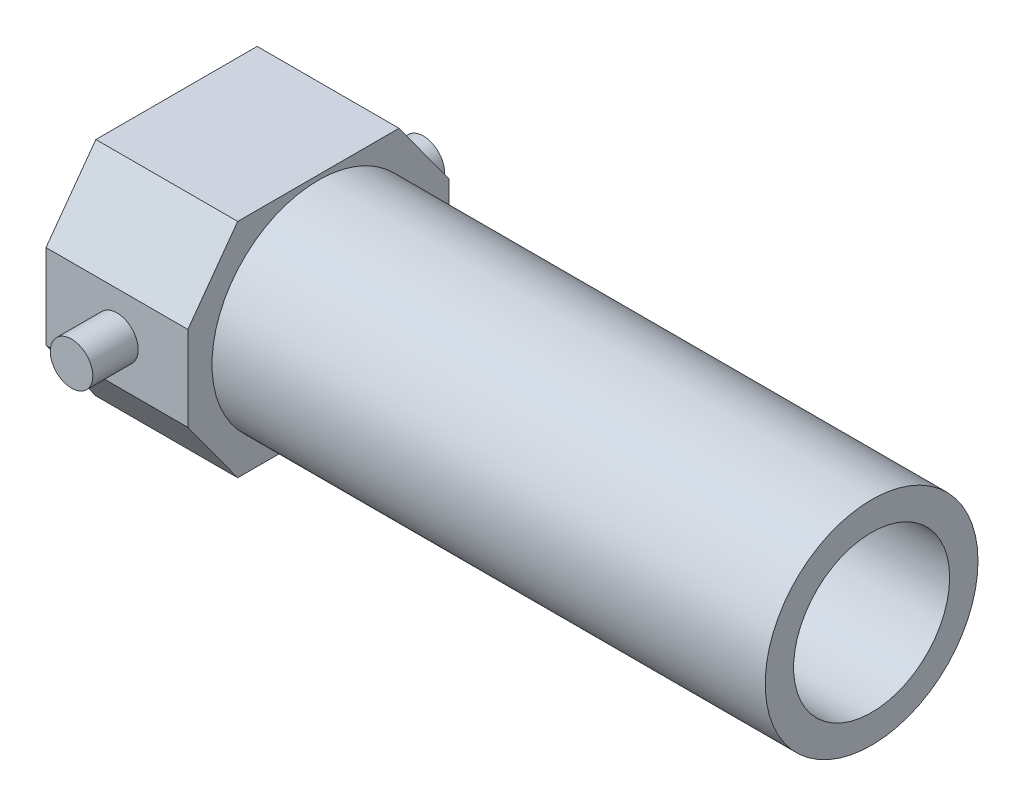
ISO-10303-21;
HEADER;
FILE_DESCRIPTION(('STEP AP214'),'2;1');
FILE_NAME('part.step','',(''),(''),'','','');
FILE_SCHEMA(('AUTOMOTIVE_DESIGN { 1 0 10303 214 1 1 1 1 }'));
ENDSEC;
DATA;
#1=APPLICATION_CONTEXT('core data for automotive mechanical design processes');
#2=APPLICATION_PROTOCOL_DEFINITION('international standard','automotive_design',2000,#1);
#3=PRODUCT_CONTEXT('',#1,'mechanical');
#4=PRODUCT('Part','Part','',(#3));
#5=PRODUCT_RELATED_PRODUCT_CATEGORY('part','',(#4));
#6=PRODUCT_DEFINITION_FORMATION('','',#4);
#7=PRODUCT_DEFINITION_CONTEXT('part definition',#1,'design');
#8=PRODUCT_DEFINITION('design','',#6,#7);
#9=PRODUCT_DEFINITION_SHAPE('','',#8);
#10=(LENGTH_UNIT() NAMED_UNIT(*) SI_UNIT(.MILLI.,.METRE.));
#11=(NAMED_UNIT(*) PLANE_ANGLE_UNIT() SI_UNIT($,.RADIAN.));
#12=(NAMED_UNIT(*) SI_UNIT($,.STERADIAN.) SOLID_ANGLE_UNIT());
#13=UNCERTAINTY_MEASURE_WITH_UNIT(LENGTH_MEASURE(1.E-05),#10,'distance_accuracy_value','');
#14=(GEOMETRIC_REPRESENTATION_CONTEXT(3) GLOBAL_UNCERTAINTY_ASSIGNED_CONTEXT((#13)) GLOBAL_UNIT_ASSIGNED_CONTEXT((#10,
#11,#12)) REPRESENTATION_CONTEXT('',''));
#15=CARTESIAN_POINT('',(0.,0.,0.));
#16=DIRECTION('',(0.,0.,1.));
#17=DIRECTION('',(1.,0.,0.));
#18=AXIS2_PLACEMENT_3D('',#15,#16,#17);
#19=CARTESIAN_POINT('',(-50.,29.8926120534272,92.));
#20=DIRECTION('',(0.,0.,1.));
#21=DIRECTION('',(0.,-1.,0.));
#22=AXIS2_PLACEMENT_3D('',#19,#20,#21);
#23=PLANE('',#22);
#24=DIRECTION('',(0.,-1.,0.));
#25=VECTOR('',#24,1.);
#26=CARTESIAN_POINT('',(49.9999999999999,29.892612053427,92.));
#27=LINE('',#26,#25);
#28=CARTESIAN_POINT('',(49.9999999999999,29.892612053427,92.));
#29=VERTEX_POINT('',#28);
#30=CARTESIAN_POINT('',(49.9999999999999,-29.8926120534276,92.));
#31=VERTEX_POINT('',#30);
#32=EDGE_CURVE('E141',#29,#31,#27,.T.);
#33=ORIENTED_EDGE('',*,*,#32,.F.);
#34=DIRECTION('',(1.,0.,0.));
#35=VECTOR('',#34,1.);
#36=CARTESIAN_POINT('',(-50.,29.8926120534272,92.));
#37=LINE('',#36,#35);
#38=CARTESIAN_POINT('',(-50.,29.8926120534272,92.));
#39=VERTEX_POINT('',#38);
#40=EDGE_CURVE('E96',#39,#29,#37,.T.);
#41=ORIENTED_EDGE('',*,*,#40,.F.);
#42=DIRECTION('',(0.,-1.,0.));
#43=VECTOR('',#42,1.);
#44=CARTESIAN_POINT('',(-50.,29.8926120534272,92.));
#45=LINE('',#44,#43);
#46=CARTESIAN_POINT('',(-50.,-29.8926120534275,92.0000000000001));
#47=VERTEX_POINT('',#46);
#48=EDGE_CURVE('E192',#39,#47,#45,.T.);
#49=ORIENTED_EDGE('',*,*,#48,.T.);
#50=DIRECTION('',(1.,0.,0.));
#51=VECTOR('',#50,1.);
#52=CARTESIAN_POINT('',(-50.,-29.8926120534275,92.0000000000001));
#53=LINE('',#52,#51);
#54=EDGE_CURVE('E167',#47,#31,#53,.T.);
#55=ORIENTED_EDGE('',*,*,#54,.T.);
#56=EDGE_LOOP('',(#33,#41,#49,#55));
#57=FACE_BOUND('',#56,.T.);
#58=CARTESIAN_POINT('',(0.,0.,92.));
#59=DIRECTION('',(0.,0.,1.));
#60=DIRECTION('',(1.,0.,0.));
#61=AXIS2_PLACEMENT_3D('',#58,#59,#60);
#62=CIRCLE('',#61,15.);
#63=CARTESIAN_POINT('',(15.,0.,92.));
#64=VERTEX_POINT('',#63);
#65=EDGE_CURVE('E180',#64,#64,#62,.T.);
#66=ORIENTED_EDGE('',*,*,#65,.F.);
#67=EDGE_LOOP('',(#66));
#68=FACE_BOUND('',#67,.T.);
#69=ADVANCED_FACE('F37',(#57,#68),#23,.T.);
#70=CARTESIAN_POINT('',(50.0000000000001,-6.66133814775094E-13,113.71825392998));
#71=DIRECTION('',(1.,0.,0.));
#72=DIRECTION('',(0.,0.,-1.));
#73=AXIS2_PLACEMENT_3D('',#70,#71,#72);
#74=PLANE('',#73);
#75=DIRECTION('',(0.,-0.809016994374953,0.587785252292465));
#76=VECTOR('',#75,1.);
#77=CARTESIAN_POINT('',(50.,78.2598743683881,56.8591269649906));
#78=LINE('',#77,#76);
#79=CARTESIAN_POINT('',(50.,78.2598743683881,56.8591269649906));
#80=VERTEX_POINT('',#79);
#81=EDGE_CURVE('E138',#80,#29,#78,.T.);
#82=ORIENTED_EDGE('',*,*,#81,.T.);
#83=ORIENTED_EDGE('',*,*,#32,.T.);
#84=DIRECTION('',(0.,-0.809016994374942,-0.587785252292481));
#85=VECTOR('',#84,1.);
#86=CARTESIAN_POINT('',(49.9999999999999,-29.8926120534276,92.));
#87=LINE('',#86,#85);
#88=CARTESIAN_POINT('',(50.,-78.2598743683873,56.8591269649898));
#89=VERTEX_POINT('',#88);
#90=EDGE_CURVE('E144',#31,#89,#87,.T.);
#91=ORIENTED_EDGE('',*,*,#90,.T.);
#92=DIRECTION('',(0.,0.,-1.));
#93=VECTOR('',#92,1.);
#94=CARTESIAN_POINT('',(50.,-78.2598743683868,-56.8591269649908));
#95=LINE('',#94,#93);
#96=CARTESIAN_POINT('',(50.,-78.2598743683868,-56.8591269649908));
#97=VERTEX_POINT('',#96);
#98=EDGE_CURVE('E147',#89,#97,#95,.T.);
#99=ORIENTED_EDGE('',*,*,#98,.T.);
#100=DIRECTION('',(0.,0.809016994374947,-0.587785252292474));
#101=VECTOR('',#100,1.);
#102=CARTESIAN_POINT('',(50.,-78.2598743683868,-56.8591269649908));
#103=LINE('',#102,#101);
#104=CARTESIAN_POINT('',(50.,-29.8926120534271,-92.));
#105=VERTEX_POINT('',#104);
#106=EDGE_CURVE('E150',#97,#105,#103,.T.);
#107=ORIENTED_EDGE('',*,*,#106,.T.);
#108=DIRECTION('',(0.,1.,0.));
#109=VECTOR('',#108,1.);
#110=CARTESIAN_POINT('',(50.,-29.8926120534271,-92.));
#111=LINE('',#110,#109);
#112=CARTESIAN_POINT('',(50.,29.8926120534286,-92.));
#113=VERTEX_POINT('',#112);
#114=EDGE_CURVE('E153',#105,#113,#111,.T.);
#115=ORIENTED_EDGE('',*,*,#114,.T.);
#116=DIRECTION('',(0.,0.809016994374943,0.587785252292479));
#117=VECTOR('',#116,1.);
#118=CARTESIAN_POINT('',(50.,29.8926120534286,-92.));
#119=LINE('',#118,#117);
#120=CARTESIAN_POINT('',(50.0000000000001,78.2598743683884,-56.8591269649902));
#121=VERTEX_POINT('',#120);
#122=EDGE_CURVE('E115',#113,#121,#119,.T.);
#123=ORIENTED_EDGE('',*,*,#122,.T.);
#124=DIRECTION('',(0.,0.,1.));
#125=VECTOR('',#124,1.);
#126=CARTESIAN_POINT('',(50.0000000000001,78.2598743683884,-56.8591269649902));
#127=LINE('',#126,#125);
#128=EDGE_CURVE('E156',#121,#80,#127,.T.);
#129=ORIENTED_EDGE('',*,*,#128,.T.);
#130=EDGE_LOOP('',(#82,#83,#91,#99,#107,#115,#123,#129));
#131=FACE_BOUND('',#130,.T.);
#132=CARTESIAN_POINT('',(50.0000000000001,0.,0.));
#133=DIRECTION('',(1.,0.,0.));
#134=DIRECTION('',(0.,0.,-1.));
#135=AXIS2_PLACEMENT_3D('',#132,#133,#134);
#136=CIRCLE('',#135,75.);
#137=CARTESIAN_POINT('',(50.0000000000001,0.,-75.));
#138=VERTEX_POINT('',#137);
#139=EDGE_CURVE('E186',#138,#138,#136,.T.);
#140=ORIENTED_EDGE('',*,*,#139,.F.);
#141=EDGE_LOOP('',(#140));
#142=FACE_BOUND('',#141,.T.);
#143=ADVANCED_FACE('F209',(#131,#142),#74,.T.);
#144=CARTESIAN_POINT('',(-50.,78.2598743683881,56.8591269649907));
#145=DIRECTION('',(0.,0.587785252292465,0.809016994374953));
#146=DIRECTION('',(0.,-0.809016994374953,0.587785252292465));
#147=AXIS2_PLACEMENT_3D('',#144,#145,#146);
#148=PLANE('',#147);
#149=ORIENTED_EDGE('',*,*,#81,.F.);
#150=DIRECTION('',(1.,0.,0.));
#151=VECTOR('',#150,1.);
#152=CARTESIAN_POINT('',(-50.,78.2598743683881,56.8591269649907));
#153=LINE('',#152,#151);
#154=CARTESIAN_POINT('',(-50.,78.2598743683881,56.8591269649907));
#155=VERTEX_POINT('',#154);
#156=EDGE_CURVE('E47',#155,#80,#153,.T.);
#157=ORIENTED_EDGE('',*,*,#156,.F.);
#158=DIRECTION('',(0.,-0.809016994374953,0.587785252292465));
#159=VECTOR('',#158,1.);
#160=CARTESIAN_POINT('',(-50.,78.2598743683881,56.8591269649907));
#161=LINE('',#160,#159);
#162=EDGE_CURVE('E159',#155,#39,#161,.T.);
#163=ORIENTED_EDGE('',*,*,#162,.T.);
#164=ORIENTED_EDGE('',*,*,#40,.T.);
#165=EDGE_LOOP('',(#149,#157,#163,#164));
#166=FACE_BOUND('',#165,.T.);
#167=ADVANCED_FACE('F207',(#166),#148,.T.);
#168=CARTESIAN_POINT('',(-50.,78.2598743683886,-56.8591269649902));
#169=DIRECTION('',(0.,1.,0.));
#170=DIRECTION('',(0.,0.,1.));
#171=AXIS2_PLACEMENT_3D('',#168,#169,#170);
#172=PLANE('',#171);
#173=ORIENTED_EDGE('',*,*,#128,.F.);
#174=DIRECTION('',(1.,0.,0.));
#175=VECTOR('',#174,1.);
#176=CARTESIAN_POINT('',(-50.,78.2598743683886,-56.8591269649902));
#177=LINE('',#176,#175);
#178=CARTESIAN_POINT('',(-50.,78.2598743683886,-56.8591269649902));
#179=VERTEX_POINT('',#178);
#180=EDGE_CURVE('E84',#179,#121,#177,.T.);
#181=ORIENTED_EDGE('',*,*,#180,.F.);
#182=DIRECTION('',(0.,0.,1.));
#183=VECTOR('',#182,1.);
#184=CARTESIAN_POINT('',(-50.,78.2598743683886,-56.8591269649902));
#185=LINE('',#184,#183);
#186=EDGE_CURVE('E128',#179,#155,#185,.T.);
#187=ORIENTED_EDGE('',*,*,#186,.T.);
#188=ORIENTED_EDGE('',*,*,#156,.T.);
#189=EDGE_LOOP('',(#173,#181,#187,#188));
#190=FACE_BOUND('',#189,.T.);
#191=ADVANCED_FACE('F211',(#190),#172,.T.);
#192=CARTESIAN_POINT('',(-50.,29.8926120534287,-92.));
#193=DIRECTION('',(0.,0.587785252292479,-0.809016994374943));
#194=DIRECTION('',(0.,0.809016994374943,0.587785252292479));
#195=AXIS2_PLACEMENT_3D('',#192,#193,#194);
#196=PLANE('',#195);
#197=ORIENTED_EDGE('',*,*,#122,.F.);
#198=DIRECTION('',(1.,0.,0.));
#199=VECTOR('',#198,1.);
#200=CARTESIAN_POINT('',(-50.,29.8926120534287,-92.));
#201=LINE('',#200,#199);
#202=CARTESIAN_POINT('',(-50.,29.8926120534287,-92.));
#203=VERTEX_POINT('',#202);
#204=EDGE_CURVE('E110',#203,#113,#201,.T.);
#205=ORIENTED_EDGE('',*,*,#204,.F.);
#206=DIRECTION('',(0.,0.809016994374943,0.587785252292479));
#207=VECTOR('',#206,1.);
#208=CARTESIAN_POINT('',(-50.,29.8926120534287,-92.));
#209=LINE('',#208,#207);
#210=EDGE_CURVE('E113',#203,#179,#209,.T.);
#211=ORIENTED_EDGE('',*,*,#210,.T.);
#212=ORIENTED_EDGE('',*,*,#180,.T.);
#213=EDGE_LOOP('',(#197,#205,#211,#212));
#214=FACE_BOUND('',#213,.T.);
#215=ADVANCED_FACE('F112',(#214),#196,.T.);
#216=CARTESIAN_POINT('',(-50.,-29.892612053427,-92.));
#217=DIRECTION('',(0.,0.,-1.));
#218=DIRECTION('',(0.,1.,0.));
#219=AXIS2_PLACEMENT_3D('',#216,#217,#218);
#220=PLANE('',#219);
#221=CARTESIAN_POINT('',(0.,0.,-92.));
#222=DIRECTION('',(0.,0.,-1.));
#223=DIRECTION('',(0.,1.,0.));
#224=AXIS2_PLACEMENT_3D('',#221,#222,#223);
#225=CIRCLE('',#224,15.);
#226=CARTESIAN_POINT('',(0.,15.,-92.));
#227=VERTEX_POINT('',#226);
#228=EDGE_CURVE('E12',#227,#227,#225,.T.);
#229=ORIENTED_EDGE('',*,*,#228,.F.);
#230=EDGE_LOOP('',(#229));
#231=FACE_BOUND('',#230,.T.);
#232=ORIENTED_EDGE('',*,*,#114,.F.);
#233=DIRECTION('',(1.,0.,0.));
#234=VECTOR('',#233,1.);
#235=CARTESIAN_POINT('',(-50.,-29.892612053427,-92.));
#236=LINE('',#235,#234);
#237=CARTESIAN_POINT('',(-50.,-29.892612053427,-92.));
#238=VERTEX_POINT('',#237);
#239=EDGE_CURVE('E120',#238,#105,#236,.T.);
#240=ORIENTED_EDGE('',*,*,#239,.F.);
#241=DIRECTION('',(0.,1.,0.));
#242=VECTOR('',#241,1.);
#243=CARTESIAN_POINT('',(-50.,-29.892612053427,-92.));
#244=LINE('',#243,#242);
#245=EDGE_CURVE('E126',#238,#203,#244,.T.);
#246=ORIENTED_EDGE('',*,*,#245,.T.);
#247=ORIENTED_EDGE('',*,*,#204,.T.);
#248=EDGE_LOOP('',(#232,#240,#246,#247));
#249=FACE_BOUND('',#248,.T.);
#250=ADVANCED_FACE('F130',(#231,#249),#220,.T.);
#251=CARTESIAN_POINT('',(-49.9999999999999,-78.2598743683868,-56.8591269649908));
#252=DIRECTION('',(0.,-0.587785252292474,-0.809016994374947));
#253=DIRECTION('',(0.,0.809016994374947,-0.587785252292474));
#254=AXIS2_PLACEMENT_3D('',#251,#252,#253);
#255=PLANE('',#254);
#256=ORIENTED_EDGE('',*,*,#106,.F.);
#257=DIRECTION('',(1.,0.,0.));
#258=VECTOR('',#257,1.);
#259=CARTESIAN_POINT('',(-49.9999999999999,-78.2598743683868,-56.8591269649908));
#260=LINE('',#259,#258);
#261=CARTESIAN_POINT('',(-49.9999999999999,-78.2598743683868,-56.8591269649908));
#262=VERTEX_POINT('',#261);
#263=EDGE_CURVE('E163',#262,#97,#260,.T.);
#264=ORIENTED_EDGE('',*,*,#263,.F.);
#265=DIRECTION('',(0.,0.809016994374947,-0.587785252292474));
#266=VECTOR('',#265,1.);
#267=CARTESIAN_POINT('',(-49.9999999999999,-78.2598743683868,-56.8591269649908));
#268=LINE('',#267,#266);
#269=EDGE_CURVE('E131',#262,#238,#268,.T.);
#270=ORIENTED_EDGE('',*,*,#269,.T.);
#271=ORIENTED_EDGE('',*,*,#239,.T.);
#272=EDGE_LOOP('',(#256,#264,#270,#271));
#273=FACE_BOUND('',#272,.T.);
#274=ADVANCED_FACE('F230',(#273),#255,.T.);
#275=CARTESIAN_POINT('',(-49.9999999999999,-78.2598743683868,-56.8591269649908));
#276=DIRECTION('',(0.,-1.,0.));
#277=DIRECTION('',(0.,0.,-1.));
#278=AXIS2_PLACEMENT_3D('',#275,#276,#277);
#279=PLANE('',#278);
#280=ORIENTED_EDGE('',*,*,#98,.F.);
#281=DIRECTION('',(1.,0.,0.));
#282=VECTOR('',#281,1.);
#283=CARTESIAN_POINT('',(-49.9999999999999,-78.2598743683873,56.8591269649898));
#284=LINE('',#283,#282);
#285=CARTESIAN_POINT('',(-49.9999999999999,-78.2598743683873,56.8591269649898));
#286=VERTEX_POINT('',#285);
#287=EDGE_CURVE('E165',#286,#89,#284,.T.);
#288=ORIENTED_EDGE('',*,*,#287,.F.);
#289=DIRECTION('',(0.,0.,-1.));
#290=VECTOR('',#289,1.);
#291=CARTESIAN_POINT('',(-49.9999999999999,-78.2598743683868,-56.8591269649908));
#292=LINE('',#291,#290);
#293=EDGE_CURVE('E133',#286,#262,#292,.T.);
#294=ORIENTED_EDGE('',*,*,#293,.T.);
#295=ORIENTED_EDGE('',*,*,#263,.T.);
#296=EDGE_LOOP('',(#280,#288,#294,#295));
#297=FACE_BOUND('',#296,.T.);
#298=ADVANCED_FACE('F200',(#297),#279,.T.);
#299=CARTESIAN_POINT('',(-50.,-29.8926120534275,92.0000000000001));
#300=DIRECTION('',(0.,-0.587785252292481,0.809016994374942));
#301=DIRECTION('',(0.,-0.809016994374942,-0.587785252292481));
#302=AXIS2_PLACEMENT_3D('',#299,#300,#301);
#303=PLANE('',#302);
#304=ORIENTED_EDGE('',*,*,#90,.F.);
#305=ORIENTED_EDGE('',*,*,#54,.F.);
#306=DIRECTION('',(0.,-0.809016994374942,-0.587785252292481));
#307=VECTOR('',#306,1.);
#308=CARTESIAN_POINT('',(-50.,-29.8926120534275,92.0000000000001));
#309=LINE('',#308,#307);
#310=EDGE_CURVE('E194',#47,#286,#309,.T.);
#311=ORIENTED_EDGE('',*,*,#310,.T.);
#312=ORIENTED_EDGE('',*,*,#287,.T.);
#313=EDGE_LOOP('',(#304,#305,#311,#312));
#314=FACE_BOUND('',#313,.T.);
#315=ADVANCED_FACE('F205',(#314),#303,.T.);
#316=CARTESIAN_POINT('',(-50.,-6.66133814775094E-13,113.71825392998));
#317=DIRECTION('',(1.,0.,0.));
#318=DIRECTION('',(0.,0.,-1.));
#319=AXIS2_PLACEMENT_3D('',#316,#317,#318);
#320=PLANE('',#319);
#321=ORIENTED_EDGE('',*,*,#162,.F.);
#322=ORIENTED_EDGE('',*,*,#186,.F.);
#323=ORIENTED_EDGE('',*,*,#210,.F.);
#324=ORIENTED_EDGE('',*,*,#245,.F.);
#325=ORIENTED_EDGE('',*,*,#269,.F.);
#326=ORIENTED_EDGE('',*,*,#293,.F.);
#327=ORIENTED_EDGE('',*,*,#310,.F.);
#328=ORIENTED_EDGE('',*,*,#48,.F.);
#329=EDGE_LOOP('',(#321,#322,#323,#324,#325,#326,#327,#328));
#330=FACE_BOUND('',#329,.T.);
#331=ADVANCED_FACE('F124',(#330),#320,.F.);
#332=CARTESIAN_POINT('',(470.,0.,0.));
#333=DIRECTION('',(-1.,0.,0.));
#334=DIRECTION('',(0.,0.,1.));
#335=AXIS2_PLACEMENT_3D('',#332,#333,#334);
#336=CYLINDRICAL_SURFACE('',#335,75.);
#337=CARTESIAN_POINT('',(440.,0.,0.));
#338=DIRECTION('',(1.,0.,0.));
#339=DIRECTION('',(0.,0.,-1.));
#340=AXIS2_PLACEMENT_3D('',#337,#338,#339);
#341=CIRCLE('',#340,75.);
#342=CARTESIAN_POINT('',(440.,0.,-75.0000000000001));
#343=VERTEX_POINT('',#342);
#344=EDGE_CURVE('E41',#343,#343,#341,.T.);
#345=ORIENTED_EDGE('',*,*,#344,.F.);
#346=EDGE_LOOP('',(#345));
#347=FACE_BOUND('',#346,.T.);
#348=ORIENTED_EDGE('',*,*,#139,.T.);
#349=EDGE_LOOP('',(#348));
#350=FACE_BOUND('',#349,.T.);
#351=ADVANCED_FACE('F261',(#347,#350),#336,.T.);
#352=CARTESIAN_POINT('',(440.,0.,0.));
#353=DIRECTION('',(1.,0.,0.));
#354=DIRECTION('',(0.,0.,-1.));
#355=AXIS2_PLACEMENT_3D('',#352,#353,#354);
#356=PLANE('',#355);
#357=CARTESIAN_POINT('',(440.,0.,0.));
#358=DIRECTION('',(1.,0.,0.));
#359=DIRECTION('',(0.,0.,-1.));
#360=AXIS2_PLACEMENT_3D('',#357,#358,#359);
#361=CIRCLE('',#360,55.);
#362=CARTESIAN_POINT('',(440.,0.,-55.0000000000001));
#363=VERTEX_POINT('',#362);
#364=EDGE_CURVE('E169',#363,#363,#361,.T.);
#365=ORIENTED_EDGE('',*,*,#364,.F.);
#366=EDGE_LOOP('',(#365));
#367=FACE_BOUND('',#366,.T.);
#368=ORIENTED_EDGE('',*,*,#344,.T.);
#369=EDGE_LOOP('',(#368));
#370=FACE_BOUND('',#369,.T.);
#371=ADVANCED_FACE('F39',(#367,#370),#356,.T.);
#372=CARTESIAN_POINT('',(0.,0.,124.));
#373=DIRECTION('',(0.,0.,-1.));
#374=DIRECTION('',(-1.,0.,0.));
#375=AXIS2_PLACEMENT_3D('',#372,#373,#374);
#376=CYLINDRICAL_SURFACE('',#375,15.);
#377=CARTESIAN_POINT('',(0.,0.,124.));
#378=DIRECTION('',(0.,0.,1.));
#379=DIRECTION('',(1.,0.,0.));
#380=AXIS2_PLACEMENT_3D('',#377,#378,#379);
#381=CIRCLE('',#380,15.);
#382=CARTESIAN_POINT('',(15.,0.,124.));
#383=VERTEX_POINT('',#382);
#384=EDGE_CURVE('E183',#383,#383,#381,.T.);
#385=ORIENTED_EDGE('',*,*,#384,.F.);
#386=EDGE_LOOP('',(#385));
#387=FACE_BOUND('',#386,.T.);
#388=ORIENTED_EDGE('',*,*,#65,.T.);
#389=EDGE_LOOP('',(#388));
#390=FACE_BOUND('',#389,.T.);
#391=ADVANCED_FACE('F253',(#387,#390),#376,.T.);
#392=CARTESIAN_POINT('',(0.,0.,124.));
#393=DIRECTION('',(0.,0.,1.));
#394=DIRECTION('',(1.,0.,0.));
#395=AXIS2_PLACEMENT_3D('',#392,#393,#394);
#396=PLANE('',#395);
#397=ORIENTED_EDGE('',*,*,#384,.T.);
#398=EDGE_LOOP('',(#397));
#399=FACE_BOUND('',#398,.T.);
#400=ADVANCED_FACE('F243',(#399),#396,.T.);
#401=CARTESIAN_POINT('',(0.,0.,-124.));
#402=DIRECTION('',(0.,0.,1.));
#403=DIRECTION('',(1.,0.,0.));
#404=AXIS2_PLACEMENT_3D('',#401,#402,#403);
#405=CYLINDRICAL_SURFACE('',#404,15.);
#406=CARTESIAN_POINT('',(0.,0.,-124.));
#407=DIRECTION('',(0.,0.,1.));
#408=DIRECTION('',(1.,0.,0.));
#409=AXIS2_PLACEMENT_3D('',#406,#407,#408);
#410=CIRCLE('',#409,15.);
#411=CARTESIAN_POINT('',(15.0000000000001,0.,-124.));
#412=VERTEX_POINT('',#411);
#413=EDGE_CURVE('E175',#412,#412,#410,.T.);
#414=ORIENTED_EDGE('',*,*,#413,.T.);
#415=EDGE_LOOP('',(#414));
#416=FACE_BOUND('',#415,.T.);
#417=ORIENTED_EDGE('',*,*,#228,.T.);
#418=EDGE_LOOP('',(#417));
#419=FACE_BOUND('',#418,.T.);
#420=ADVANCED_FACE('F240',(#416,#419),#405,.T.);
#421=CARTESIAN_POINT('',(0.,0.,-124.));
#422=DIRECTION('',(0.,0.,-1.));
#423=DIRECTION('',(1.,0.,0.));
#424=AXIS2_PLACEMENT_3D('',#421,#422,#423);
#425=PLANE('',#424);
#426=ORIENTED_EDGE('',*,*,#413,.F.);
#427=EDGE_LOOP('',(#426));
#428=FACE_BOUND('',#427,.T.);
#429=ADVANCED_FACE('F242',(#428),#425,.T.);
#430=CARTESIAN_POINT('',(70.0000000000001,1.11022302462516E-13,0.));
#431=DIRECTION('',(1.,0.,0.));
#432=DIRECTION('',(0.,0.,-1.));
#433=AXIS2_PLACEMENT_3D('',#430,#431,#432);
#434=CYLINDRICAL_SURFACE('',#433,55.);
#435=CARTESIAN_POINT('',(70.0000000000001,1.11022302462516E-13,0.));
#436=DIRECTION('',(1.,0.,0.));
#437=DIRECTION('',(0.,0.,-1.));
#438=AXIS2_PLACEMENT_3D('',#435,#436,#437);
#439=CIRCLE('',#438,55.);
#440=CARTESIAN_POINT('',(70.0000000000001,1.09397106422643E-13,-55.));
#441=VERTEX_POINT('',#440);
#442=EDGE_CURVE('E171',#441,#441,#439,.T.);
#443=ORIENTED_EDGE('',*,*,#442,.F.);
#444=EDGE_LOOP('',(#443));
#445=FACE_BOUND('',#444,.T.);
#446=ORIENTED_EDGE('',*,*,#364,.T.);
#447=EDGE_LOOP('',(#446));
#448=FACE_BOUND('',#447,.T.);
#449=ADVANCED_FACE('F250',(#445,#448),#434,.F.);
#450=CARTESIAN_POINT('',(70.0000000000001,1.11022302462516E-13,0.));
#451=DIRECTION('',(1.,0.,0.));
#452=DIRECTION('',(0.,0.,-1.));
#453=AXIS2_PLACEMENT_3D('',#450,#451,#452);
#454=PLANE('',#453);
#455=ORIENTED_EDGE('',*,*,#442,.T.);
#456=EDGE_LOOP('',(#455));
#457=FACE_BOUND('',#456,.T.);
#458=ADVANCED_FACE('F356',(#457),#454,.T.);
#459=CLOSED_SHELL('',(#69,#143,#167,#191,#215,#250,#274,#298,#315,#331,#351,#371,#391,#400,#420,
#429,#449,#458));
#460=MANIFOLD_SOLID_BREP('B2',#459);
#461=ADVANCED_BREP_SHAPE_REPRESENTATION('',(#18,#460),#14);
#462=SHAPE_DEFINITION_REPRESENTATION(#9,#461);
ENDSEC;
END-ISO-10303-21;
